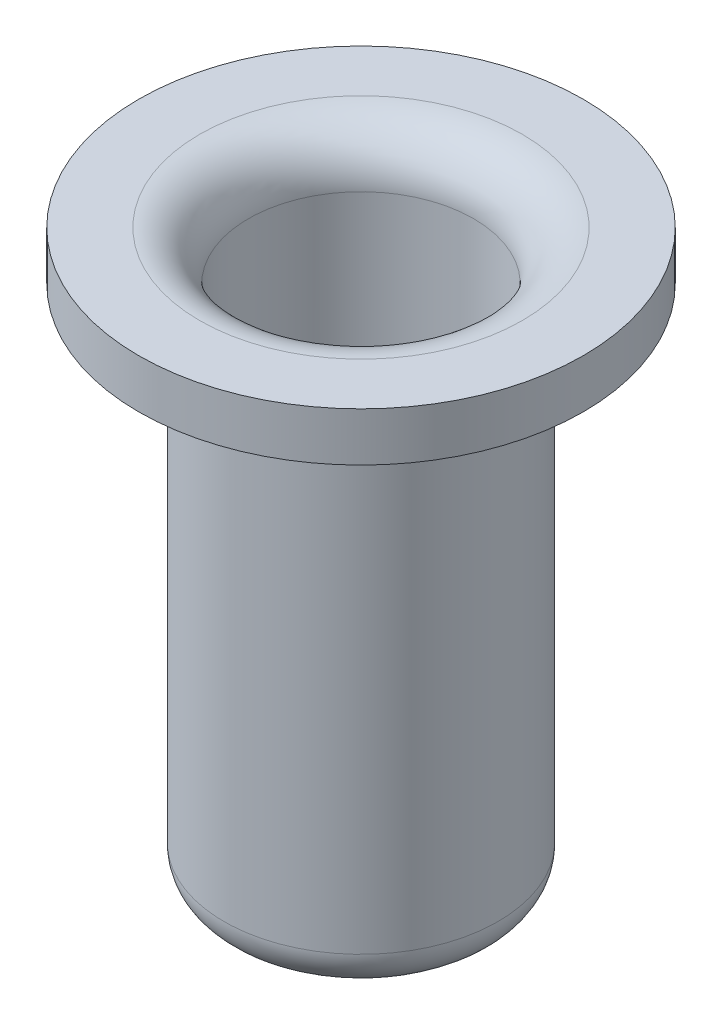
ISO-10303-21;
HEADER;
FILE_DESCRIPTION(('STEP AP214'),'2;1');
FILE_NAME('part.step','',(''),(''),'','','');
FILE_SCHEMA(('AUTOMOTIVE_DESIGN { 1 0 10303 214 1 1 1 1 }'));
ENDSEC;
DATA;
#1=APPLICATION_CONTEXT('core data for automotive mechanical design processes');
#2=APPLICATION_PROTOCOL_DEFINITION('international standard','automotive_design',2000,#1);
#3=PRODUCT_CONTEXT('',#1,'mechanical');
#4=PRODUCT('Part','Part','',(#3));
#5=PRODUCT_RELATED_PRODUCT_CATEGORY('part','',(#4));
#6=PRODUCT_DEFINITION_FORMATION('','',#4);
#7=PRODUCT_DEFINITION_CONTEXT('part definition',#1,'design');
#8=PRODUCT_DEFINITION('design','',#6,#7);
#9=PRODUCT_DEFINITION_SHAPE('','',#8);
#10=(LENGTH_UNIT() NAMED_UNIT(*) SI_UNIT(.MILLI.,.METRE.));
#11=(NAMED_UNIT(*) PLANE_ANGLE_UNIT() SI_UNIT($,.RADIAN.));
#12=(NAMED_UNIT(*) SI_UNIT($,.STERADIAN.) SOLID_ANGLE_UNIT());
#13=UNCERTAINTY_MEASURE_WITH_UNIT(LENGTH_MEASURE(1.E-05),#10,'distance_accuracy_value','');
#14=(GEOMETRIC_REPRESENTATION_CONTEXT(3) GLOBAL_UNCERTAINTY_ASSIGNED_CONTEXT((#13)) GLOBAL_UNIT_ASSIGNED_CONTEXT((#10,
#11,#12)) REPRESENTATION_CONTEXT('',''));
#15=CARTESIAN_POINT('',(0.,0.,0.));
#16=DIRECTION('',(0.,0.,1.));
#17=DIRECTION('',(1.,0.,0.));
#18=AXIS2_PLACEMENT_3D('',#15,#16,#17);
#19=CARTESIAN_POINT('',(0.,0.,0.));
#20=DIRECTION('',(0.,-1.,0.));
#21=DIRECTION('',(0.,0.,-1.));
#22=AXIS2_PLACEMENT_3D('',#19,#20,#21);
#23=PLANE('',#22);
#24=CARTESIAN_POINT('',(0.,0.,0.));
#25=DIRECTION('',(0.,-1.,0.));
#26=DIRECTION('',(0.,0.,-1.));
#27=AXIS2_PLACEMENT_3D('',#24,#25,#26);
#28=CIRCLE('',#27,16.);
#29=CARTESIAN_POINT('',(0.,0.,-16.));
#30=VERTEX_POINT('',#29);
#31=EDGE_CURVE('E55',#30,#30,#28,.T.);
#32=ORIENTED_EDGE('',*,*,#31,.T.);
#33=EDGE_LOOP('',(#32));
#34=FACE_BOUND('',#33,.T.);
#35=ADVANCED_FACE('F35',(#34),#23,.T.);
#36=CARTESIAN_POINT('',(0.,6.50000000000001,0.));
#37=DIRECTION('',(0.,-1.,0.));
#38=DIRECTION('',(0.,0.,-1.));
#39=AXIS2_PLACEMENT_3D('',#36,#37,#38);
#40=TOROIDAL_SURFACE('',#39,16.,6.5);
#41=CARTESIAN_POINT('',(0.,6.50000000000001,0.));
#42=DIRECTION('',(0.,-1.,0.));
#43=DIRECTION('',(0.,0.,-1.));
#44=AXIS2_PLACEMENT_3D('',#41,#42,#43);
#45=CIRCLE('',#44,22.5);
#46=CARTESIAN_POINT('',(0.,6.50000000000001,-22.5));
#47=VERTEX_POINT('',#46);
#48=EDGE_CURVE('E58',#47,#47,#45,.T.);
#49=ORIENTED_EDGE('',*,*,#48,.T.);
#50=EDGE_LOOP('',(#49));
#51=FACE_BOUND('',#50,.T.);
#52=ORIENTED_EDGE('',*,*,#31,.F.);
#53=EDGE_LOOP('',(#52));
#54=FACE_BOUND('',#53,.T.);
#55=ADVANCED_FACE('F89',(#51,#54),#40,.T.);
#56=CARTESIAN_POINT('',(0.,0.,0.));
#57=DIRECTION('',(0.,-1.,0.));
#58=DIRECTION('',(0.,0.,-1.));
#59=AXIS2_PLACEMENT_3D('',#56,#57,#58);
#60=CYLINDRICAL_SURFACE('',#59,22.5);
#61=CARTESIAN_POINT('',(0.,82.,0.));
#62=DIRECTION('',(0.,-1.,0.));
#63=DIRECTION('',(0.,0.,-1.));
#64=AXIS2_PLACEMENT_3D('',#61,#62,#63);
#65=CIRCLE('',#64,22.5);
#66=CARTESIAN_POINT('',(0.,82.,-22.5));
#67=VERTEX_POINT('',#66);
#68=EDGE_CURVE('E50',#67,#67,#65,.T.);
#69=ORIENTED_EDGE('',*,*,#68,.T.);
#70=EDGE_LOOP('',(#69));
#71=FACE_BOUND('',#70,.T.);
#72=ORIENTED_EDGE('',*,*,#48,.F.);
#73=EDGE_LOOP('',(#72));
#74=FACE_BOUND('',#73,.T.);
#75=ADVANCED_FACE('F95',(#71,#74),#60,.T.);
#76=CARTESIAN_POINT('',(22.5,86.,0.));
#77=DIRECTION('',(0.,-1.,0.));
#78=DIRECTION('',(0.,0.,-1.));
#79=AXIS2_PLACEMENT_3D('',#76,#77,#78);
#80=PLANE('',#79);
#81=CARTESIAN_POINT('',(0.,86.,0.));
#82=DIRECTION('',(0.,-1.,0.));
#83=DIRECTION('',(0.,0.,-1.));
#84=AXIS2_PLACEMENT_3D('',#81,#82,#83);
#85=CIRCLE('',#84,26.5);
#86=CARTESIAN_POINT('',(0.,86.,-26.5));
#87=VERTEX_POINT('',#86);
#88=EDGE_CURVE('E46',#87,#87,#85,.F.);
#89=ORIENTED_EDGE('',*,*,#88,.T.);
#90=EDGE_LOOP('',(#89));
#91=FACE_BOUND('',#90,.T.);
#92=CARTESIAN_POINT('',(0.,86.,0.));
#93=DIRECTION('',(0.,-1.,0.));
#94=DIRECTION('',(0.,0.,-1.));
#95=AXIS2_PLACEMENT_3D('',#92,#93,#94);
#96=CIRCLE('',#95,36.5);
#97=CARTESIAN_POINT('',(0.,86.,-36.5));
#98=VERTEX_POINT('',#97);
#99=EDGE_CURVE('E61',#98,#98,#96,.T.);
#100=ORIENTED_EDGE('',*,*,#99,.T.);
#101=EDGE_LOOP('',(#100));
#102=FACE_BOUND('',#101,.T.);
#103=ADVANCED_FACE('F101',(#91,#102),#80,.T.);
#104=CARTESIAN_POINT('',(0.,0.,0.));
#105=DIRECTION('',(0.,-1.,0.));
#106=DIRECTION('',(0.,0.,-1.));
#107=AXIS2_PLACEMENT_3D('',#104,#105,#106);
#108=CYLINDRICAL_SURFACE('',#107,36.5);
#109=CARTESIAN_POINT('',(0.,94.,0.));
#110=DIRECTION('',(0.,-1.,0.));
#111=DIRECTION('',(0.,0.,-1.));
#112=AXIS2_PLACEMENT_3D('',#109,#110,#111);
#113=CIRCLE('',#112,36.5);
#114=CARTESIAN_POINT('',(0.,94.,-36.5));
#115=VERTEX_POINT('',#114);
#116=EDGE_CURVE('E64',#115,#115,#113,.T.);
#117=ORIENTED_EDGE('',*,*,#116,.T.);
#118=EDGE_LOOP('',(#117));
#119=FACE_BOUND('',#118,.T.);
#120=ORIENTED_EDGE('',*,*,#99,.F.);
#121=EDGE_LOOP('',(#120));
#122=FACE_BOUND('',#121,.T.);
#123=ADVANCED_FACE('F105',(#119,#122),#108,.T.);
#124=CARTESIAN_POINT('',(36.5,94.,0.));
#125=DIRECTION('',(0.,1.,0.));
#126=DIRECTION('',(0.,0.,1.));
#127=AXIS2_PLACEMENT_3D('',#124,#125,#126);
#128=PLANE('',#127);
#129=CARTESIAN_POINT('',(0.,94.,0.));
#130=DIRECTION('',(0.,1.,0.));
#131=DIRECTION('',(0.,0.,1.));
#132=AXIS2_PLACEMENT_3D('',#129,#130,#131);
#133=CIRCLE('',#132,26.5);
#134=CARTESIAN_POINT('',(0.,94.,26.5));
#135=VERTEX_POINT('',#134);
#136=EDGE_CURVE('E42',#135,#135,#133,.F.);
#137=ORIENTED_EDGE('',*,*,#136,.T.);
#138=EDGE_LOOP('',(#137));
#139=FACE_BOUND('',#138,.T.);
#140=ORIENTED_EDGE('',*,*,#116,.F.);
#141=EDGE_LOOP('',(#140));
#142=FACE_BOUND('',#141,.T.);
#143=ADVANCED_FACE('F109',(#139,#142),#128,.T.);
#144=CARTESIAN_POINT('',(0.,0.,0.));
#145=DIRECTION('',(0.,-1.,0.));
#146=DIRECTION('',(0.,0.,-1.));
#147=AXIS2_PLACEMENT_3D('',#144,#145,#146);
#148=CYLINDRICAL_SURFACE('',#147,18.5);
#149=CARTESIAN_POINT('',(0.,86.,0.));
#150=DIRECTION('',(0.,1.,0.));
#151=DIRECTION('',(0.,0.,1.));
#152=AXIS2_PLACEMENT_3D('',#149,#150,#151);
#153=CIRCLE('',#152,18.5);
#154=CARTESIAN_POINT('',(0.,86.,18.5));
#155=VERTEX_POINT('',#154);
#156=EDGE_CURVE('E10',#155,#155,#153,.T.);
#157=ORIENTED_EDGE('',*,*,#156,.T.);
#158=EDGE_LOOP('',(#157));
#159=FACE_BOUND('',#158,.T.);
#160=CARTESIAN_POINT('',(0.,6.50000000000001,0.));
#161=DIRECTION('',(0.,-1.,0.));
#162=DIRECTION('',(0.,0.,-1.));
#163=AXIS2_PLACEMENT_3D('',#160,#161,#162);
#164=CIRCLE('',#163,18.5);
#165=CARTESIAN_POINT('',(0.,6.50000000000001,-18.5));
#166=VERTEX_POINT('',#165);
#167=EDGE_CURVE('E67',#166,#166,#164,.T.);
#168=ORIENTED_EDGE('',*,*,#167,.T.);
#169=EDGE_LOOP('',(#168));
#170=FACE_BOUND('',#169,.T.);
#171=ADVANCED_FACE('F86',(#159,#170),#148,.F.);
#172=CARTESIAN_POINT('',(0.,6.50000000000001,0.));
#173=DIRECTION('',(0.,-1.,0.));
#174=DIRECTION('',(0.,0.,-1.));
#175=AXIS2_PLACEMENT_3D('',#172,#173,#174);
#176=TOROIDAL_SURFACE('',#175,16.,2.5);
#177=CARTESIAN_POINT('',(0.,4.,0.));
#178=DIRECTION('',(0.,-1.,0.));
#179=DIRECTION('',(0.,0.,-1.));
#180=AXIS2_PLACEMENT_3D('',#177,#178,#179);
#181=CIRCLE('',#180,16.);
#182=CARTESIAN_POINT('',(0.,4.,-16.));
#183=VERTEX_POINT('',#182);
#184=EDGE_CURVE('E70',#183,#183,#181,.T.);
#185=ORIENTED_EDGE('',*,*,#184,.T.);
#186=EDGE_LOOP('',(#185));
#187=FACE_BOUND('',#186,.T.);
#188=ORIENTED_EDGE('',*,*,#167,.F.);
#189=EDGE_LOOP('',(#188));
#190=FACE_BOUND('',#189,.T.);
#191=ADVANCED_FACE('F74',(#187,#190),#176,.F.);
#192=CARTESIAN_POINT('',(16.,4.,0.));
#193=DIRECTION('',(0.,1.,0.));
#194=DIRECTION('',(0.,0.,1.));
#195=AXIS2_PLACEMENT_3D('',#192,#193,#194);
#196=PLANE('',#195);
#197=ORIENTED_EDGE('',*,*,#184,.F.);
#198=EDGE_LOOP('',(#197));
#199=FACE_BOUND('',#198,.T.);
#200=ADVANCED_FACE('F77',(#199),#196,.T.);
#201=CARTESIAN_POINT('',(0.,82.,0.));
#202=DIRECTION('',(0.,-1.,0.));
#203=DIRECTION('',(0.,0.,-1.));
#204=AXIS2_PLACEMENT_3D('',#201,#202,#203);
#205=TOROIDAL_SURFACE('',#204,26.5,4.);
#206=ORIENTED_EDGE('',*,*,#88,.F.);
#207=EDGE_LOOP('',(#206));
#208=FACE_BOUND('',#207,.T.);
#209=ORIENTED_EDGE('',*,*,#68,.F.);
#210=EDGE_LOOP('',(#209));
#211=FACE_BOUND('',#210,.T.);
#212=ADVANCED_FACE('F79',(#208,#211),#205,.F.);
#213=CARTESIAN_POINT('',(0.,86.,0.));
#214=DIRECTION('',(0.,1.,0.));
#215=DIRECTION('',(0.,0.,1.));
#216=AXIS2_PLACEMENT_3D('',#213,#214,#215);
#217=TOROIDAL_SURFACE('',#216,26.5,8.);
#218=ORIENTED_EDGE('',*,*,#156,.F.);
#219=EDGE_LOOP('',(#218));
#220=FACE_BOUND('',#219,.T.);
#221=ORIENTED_EDGE('',*,*,#136,.F.);
#222=EDGE_LOOP('',(#221));
#223=FACE_BOUND('',#222,.T.);
#224=ADVANCED_FACE('F37',(#220,#223),#217,.T.);
#225=CLOSED_SHELL('',(#35,#55,#75,#103,#123,#143,#171,#191,#200,#212,#224));
#226=MANIFOLD_SOLID_BREP('B2',#225);
#227=ADVANCED_BREP_SHAPE_REPRESENTATION('',(#18,#226),#14);
#228=SHAPE_DEFINITION_REPRESENTATION(#9,#227);
ENDSEC;
END-ISO-10303-21;
